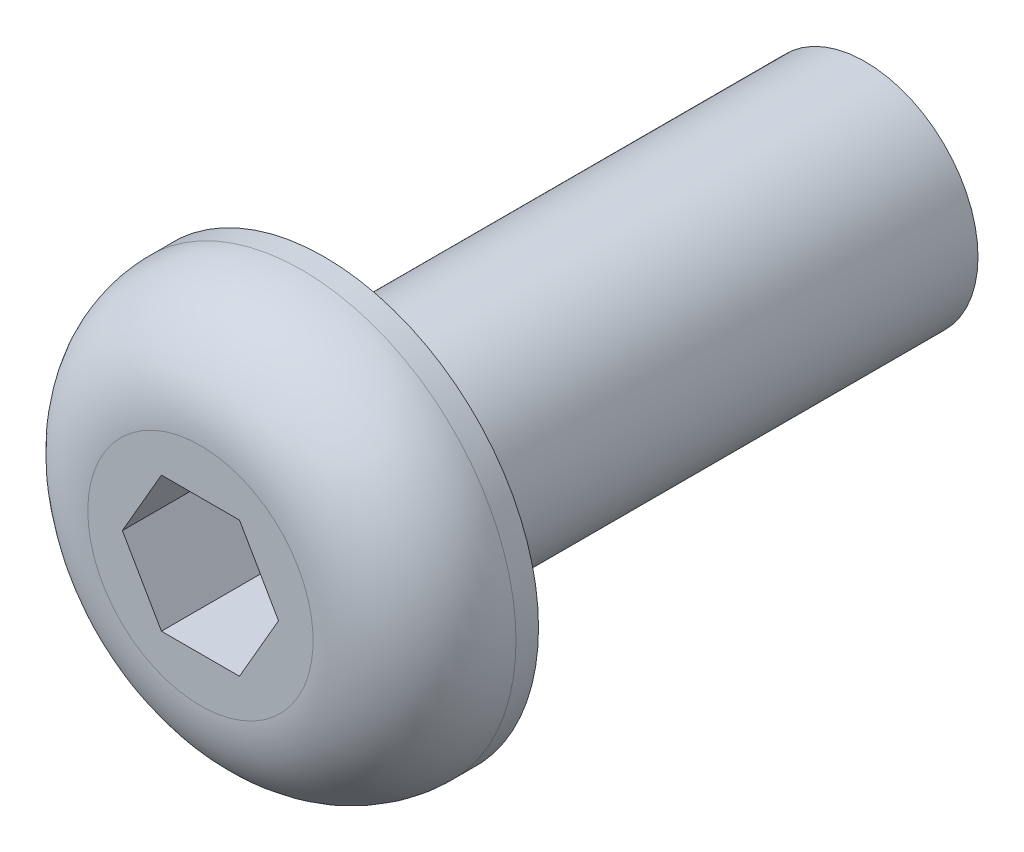
ISO-10303-21;
HEADER;
FILE_DESCRIPTION(('STEP AP214'),'2;1');
FILE_NAME('part.step','',(''),(''),'','','');
FILE_SCHEMA(('AUTOMOTIVE_DESIGN { 1 0 10303 214 1 1 1 1 }'));
ENDSEC;
DATA;
#1=APPLICATION_CONTEXT('core data for automotive mechanical design processes');
#2=APPLICATION_PROTOCOL_DEFINITION('international standard','automotive_design',2000,#1);
#3=PRODUCT_CONTEXT('',#1,'mechanical');
#4=PRODUCT('Part','Part','',(#3));
#5=PRODUCT_RELATED_PRODUCT_CATEGORY('part','',(#4));
#6=PRODUCT_DEFINITION_FORMATION('','',#4);
#7=PRODUCT_DEFINITION_CONTEXT('part definition',#1,'design');
#8=PRODUCT_DEFINITION('design','',#6,#7);
#9=PRODUCT_DEFINITION_SHAPE('','',#8);
#10=(LENGTH_UNIT() NAMED_UNIT(*) SI_UNIT(.MILLI.,.METRE.));
#11=(NAMED_UNIT(*) PLANE_ANGLE_UNIT() SI_UNIT($,.RADIAN.));
#12=(NAMED_UNIT(*) SI_UNIT($,.STERADIAN.) SOLID_ANGLE_UNIT());
#13=UNCERTAINTY_MEASURE_WITH_UNIT(LENGTH_MEASURE(1.E-05),#10,'distance_accuracy_value','');
#14=(GEOMETRIC_REPRESENTATION_CONTEXT(3) GLOBAL_UNCERTAINTY_ASSIGNED_CONTEXT((#13)) GLOBAL_UNIT_ASSIGNED_CONTEXT((#10,
#11,#12)) REPRESENTATION_CONTEXT('',''));
#15=CARTESIAN_POINT('',(0.,0.,0.));
#16=DIRECTION('',(0.,0.,1.));
#17=DIRECTION('',(1.,0.,0.));
#18=AXIS2_PLACEMENT_3D('',#15,#16,#17);
#19=CARTESIAN_POINT('',(0.,0.,-12.));
#20=DIRECTION('',(0.,0.,1.));
#21=DIRECTION('',(1.,0.,0.));
#22=AXIS2_PLACEMENT_3D('',#19,#20,#21);
#23=CYLINDRICAL_SURFACE('',#22,2.5);
#24=CARTESIAN_POINT('',(0.,0.,-12.));
#25=DIRECTION('',(0.,0.,1.));
#26=DIRECTION('',(1.,0.,0.));
#27=AXIS2_PLACEMENT_3D('',#24,#25,#26);
#28=CIRCLE('',#27,2.5);
#29=CARTESIAN_POINT('',(2.5,0.,-12.));
#30=VERTEX_POINT('',#29);
#31=EDGE_CURVE('E11',#30,#30,#28,.T.);
#32=ORIENTED_EDGE('',*,*,#31,.T.);
#33=EDGE_LOOP('',(#32));
#34=FACE_BOUND('',#33,.T.);
#35=CARTESIAN_POINT('',(0.,0.,0.));
#36=DIRECTION('',(0.,0.,1.));
#37=DIRECTION('',(1.,0.,0.));
#38=AXIS2_PLACEMENT_3D('',#35,#36,#37);
#39=CIRCLE('',#38,2.5);
#40=CARTESIAN_POINT('',(2.5,0.,0.));
#41=VERTEX_POINT('',#40);
#42=EDGE_CURVE('E37',#41,#41,#39,.T.);
#43=ORIENTED_EDGE('',*,*,#42,.F.);
#44=EDGE_LOOP('',(#43));
#45=FACE_BOUND('',#44,.T.);
#46=ADVANCED_FACE('F34',(#34,#45),#23,.T.);
#47=CARTESIAN_POINT('',(0.,0.,-12.));
#48=DIRECTION('',(0.,0.,1.));
#49=DIRECTION('',(1.,0.,0.));
#50=AXIS2_PLACEMENT_3D('',#47,#48,#49);
#51=PLANE('',#50);
#52=ORIENTED_EDGE('',*,*,#31,.F.);
#53=EDGE_LOOP('',(#52));
#54=FACE_BOUND('',#53,.T.);
#55=ADVANCED_FACE('F157',(#54),#51,.F.);
#56=CARTESIAN_POINT('',(0.,0.,2.75));
#57=DIRECTION('',(0.,0.,1.));
#58=DIRECTION('',(1.,0.,0.));
#59=AXIS2_PLACEMENT_3D('',#56,#57,#58);
#60=PLANE('',#59);
#61=DIRECTION('',(-1.,0.,0.));
#62=VECTOR('',#61,1.);
#63=CARTESIAN_POINT('',(0.866025403784439,1.5,2.75));
#64=LINE('',#63,#62);
#65=CARTESIAN_POINT('',(0.866025403784439,1.5,2.75));
#66=VERTEX_POINT('',#65);
#67=CARTESIAN_POINT('',(-0.866025403784438,1.5,2.75));
#68=VERTEX_POINT('',#67);
#69=EDGE_CURVE('E48',#66,#68,#64,.T.);
#70=ORIENTED_EDGE('',*,*,#69,.F.);
#71=DIRECTION('',(-0.5,0.866025403784439,0.));
#72=VECTOR('',#71,1.);
#73=CARTESIAN_POINT('',(1.73205080756888,0.,2.75));
#74=LINE('',#73,#72);
#75=CARTESIAN_POINT('',(1.73205080756888,0.,2.75));
#76=VERTEX_POINT('',#75);
#77=EDGE_CURVE('E131',#76,#66,#74,.T.);
#78=ORIENTED_EDGE('',*,*,#77,.F.);
#79=DIRECTION('',(0.5,0.866025403784439,0.));
#80=VECTOR('',#79,1.);
#81=CARTESIAN_POINT('',(0.866025403784439,-1.5,2.75));
#82=LINE('',#81,#80);
#83=CARTESIAN_POINT('',(0.866025403784439,-1.5,2.75));
#84=VERTEX_POINT('',#83);
#85=EDGE_CURVE('E129',#84,#76,#82,.T.);
#86=ORIENTED_EDGE('',*,*,#85,.F.);
#87=DIRECTION('',(1.,0.,0.));
#88=VECTOR('',#87,1.);
#89=CARTESIAN_POINT('',(-0.866025403784439,-1.5,2.75));
#90=LINE('',#89,#88);
#91=CARTESIAN_POINT('',(-0.866025403784439,-1.5,2.75));
#92=VERTEX_POINT('',#91);
#93=EDGE_CURVE('E96',#92,#84,#90,.T.);
#94=ORIENTED_EDGE('',*,*,#93,.F.);
#95=DIRECTION('',(0.5,-0.866025403784439,0.));
#96=VECTOR('',#95,1.);
#97=CARTESIAN_POINT('',(-1.73205080756888,0.,2.75));
#98=LINE('',#97,#96);
#99=CARTESIAN_POINT('',(-1.73205080756888,0.,2.75));
#100=VERTEX_POINT('',#99);
#101=EDGE_CURVE('E125',#100,#92,#98,.T.);
#102=ORIENTED_EDGE('',*,*,#101,.F.);
#103=DIRECTION('',(-0.5,-0.866025403784439,0.));
#104=VECTOR('',#103,1.);
#105=CARTESIAN_POINT('',(-0.866025403784438,1.5,2.75));
#106=LINE('',#105,#104);
#107=EDGE_CURVE('E122',#68,#100,#106,.T.);
#108=ORIENTED_EDGE('',*,*,#107,.F.);
#109=EDGE_LOOP('',(#70,#78,#86,#94,#102,#108));
#110=FACE_BOUND('',#109,.T.);
#111=CARTESIAN_POINT('',(0.,0.,2.75));
#112=DIRECTION('',(0.,0.,-1.));
#113=DIRECTION('',(-1.,0.,0.));
#114=AXIS2_PLACEMENT_3D('',#111,#112,#113);
#115=CIRCLE('',#114,2.5);
#116=CARTESIAN_POINT('',(-2.5,0.,2.75));
#117=VERTEX_POINT('',#116);
#118=EDGE_CURVE('E146',#117,#117,#115,.T.);
#119=ORIENTED_EDGE('',*,*,#118,.F.);
#120=EDGE_LOOP('',(#119));
#121=FACE_BOUND('',#120,.T.);
#122=ADVANCED_FACE('F162',(#110,#121),#60,.T.);
#123=CARTESIAN_POINT('',(0.,0.,0.5));
#124=DIRECTION('',(0.,0.,-1.));
#125=DIRECTION('',(-1.,0.,0.));
#126=AXIS2_PLACEMENT_3D('',#123,#124,#125);
#127=TOROIDAL_SURFACE('',#126,2.5,2.25);
#128=ORIENTED_EDGE('',*,*,#118,.T.);
#129=EDGE_LOOP('',(#128));
#130=FACE_BOUND('',#129,.T.);
#131=CARTESIAN_POINT('',(0.,0.,0.5));
#132=DIRECTION('',(0.,0.,-1.));
#133=DIRECTION('',(-1.,0.,0.));
#134=AXIS2_PLACEMENT_3D('',#131,#132,#133);
#135=CIRCLE('',#134,4.75);
#136=CARTESIAN_POINT('',(-4.75,0.,0.5));
#137=VERTEX_POINT('',#136);
#138=EDGE_CURVE('E143',#137,#137,#135,.T.);
#139=ORIENTED_EDGE('',*,*,#138,.F.);
#140=EDGE_LOOP('',(#139));
#141=FACE_BOUND('',#140,.T.);
#142=ADVANCED_FACE('F168',(#130,#141),#127,.T.);
#143=CARTESIAN_POINT('',(0.,0.,0.));
#144=DIRECTION('',(0.,0.,-1.));
#145=DIRECTION('',(-1.,0.,0.));
#146=AXIS2_PLACEMENT_3D('',#143,#144,#145);
#147=CYLINDRICAL_SURFACE('',#146,4.75);
#148=ORIENTED_EDGE('',*,*,#138,.T.);
#149=EDGE_LOOP('',(#148));
#150=FACE_BOUND('',#149,.T.);
#151=CARTESIAN_POINT('',(0.,0.,0.));
#152=DIRECTION('',(0.,0.,-1.));
#153=DIRECTION('',(-1.,0.,0.));
#154=AXIS2_PLACEMENT_3D('',#151,#152,#153);
#155=CIRCLE('',#154,4.75);
#156=CARTESIAN_POINT('',(-4.75,0.,0.));
#157=VERTEX_POINT('',#156);
#158=EDGE_CURVE('E135',#157,#157,#155,.T.);
#159=ORIENTED_EDGE('',*,*,#158,.F.);
#160=EDGE_LOOP('',(#159));
#161=FACE_BOUND('',#160,.T.);
#162=ADVANCED_FACE('F174',(#150,#161),#147,.T.);
#163=CARTESIAN_POINT('',(0.,0.,0.));
#164=DIRECTION('',(0.,0.,-1.));
#165=DIRECTION('',(-1.,0.,0.));
#166=AXIS2_PLACEMENT_3D('',#163,#164,#165);
#167=PLANE('',#166);
#168=ORIENTED_EDGE('',*,*,#42,.T.);
#169=EDGE_LOOP('',(#168));
#170=FACE_BOUND('',#169,.T.);
#171=ORIENTED_EDGE('',*,*,#158,.T.);
#172=EDGE_LOOP('',(#171));
#173=FACE_BOUND('',#172,.T.);
#174=ADVANCED_FACE('F153',(#170,#173),#167,.T.);
#175=CARTESIAN_POINT('',(0.866025403784439,1.5,0.25));
#176=DIRECTION('',(0.,1.,0.));
#177=DIRECTION('',(-1.,0.,0.));
#178=AXIS2_PLACEMENT_3D('',#175,#176,#177);
#179=PLANE('',#178);
#180=ORIENTED_EDGE('',*,*,#69,.T.);
#181=DIRECTION('',(0.,0.,1.));
#182=VECTOR('',#181,1.);
#183=CARTESIAN_POINT('',(-0.866025403784438,1.5,0.25));
#184=LINE('',#183,#182);
#185=CARTESIAN_POINT('',(-0.866025403784438,1.5,0.25));
#186=VERTEX_POINT('',#185);
#187=EDGE_CURVE('E78',#186,#68,#184,.T.);
#188=ORIENTED_EDGE('',*,*,#187,.F.);
#189=DIRECTION('',(-1.,0.,0.));
#190=VECTOR('',#189,1.);
#191=CARTESIAN_POINT('',(0.866025403784439,1.5,0.25));
#192=LINE('',#191,#190);
#193=CARTESIAN_POINT('',(0.866025403784439,1.5,0.25));
#194=VERTEX_POINT('',#193);
#195=EDGE_CURVE('E133',#194,#186,#192,.T.);
#196=ORIENTED_EDGE('',*,*,#195,.F.);
#197=DIRECTION('',(0.,0.,1.));
#198=VECTOR('',#197,1.);
#199=CARTESIAN_POINT('',(0.866025403784439,1.5,0.25));
#200=LINE('',#199,#198);
#201=EDGE_CURVE('E56',#194,#66,#200,.T.);
#202=ORIENTED_EDGE('',*,*,#201,.T.);
#203=EDGE_LOOP('',(#180,#188,#196,#202));
#204=FACE_BOUND('',#203,.T.);
#205=ADVANCED_FACE('F180',(#204),#179,.F.);
#206=CARTESIAN_POINT('',(1.73205080756888,0.,0.25));
#207=DIRECTION('',(0.866025403784439,0.5,0.));
#208=DIRECTION('',(-0.5,0.866025403784439,0.));
#209=AXIS2_PLACEMENT_3D('',#206,#207,#208);
#210=PLANE('',#209);
#211=ORIENTED_EDGE('',*,*,#77,.T.);
#212=ORIENTED_EDGE('',*,*,#201,.F.);
#213=DIRECTION('',(-0.5,0.866025403784439,0.));
#214=VECTOR('',#213,1.);
#215=CARTESIAN_POINT('',(1.73205080756888,0.,0.25));
#216=LINE('',#215,#214);
#217=CARTESIAN_POINT('',(1.73205080756888,0.,0.25));
#218=VERTEX_POINT('',#217);
#219=EDGE_CURVE('E108',#218,#194,#216,.T.);
#220=ORIENTED_EDGE('',*,*,#219,.F.);
#221=DIRECTION('',(0.,0.,1.));
#222=VECTOR('',#221,1.);
#223=CARTESIAN_POINT('',(1.73205080756888,0.,0.25));
#224=LINE('',#223,#222);
#225=EDGE_CURVE('E100',#218,#76,#224,.T.);
#226=ORIENTED_EDGE('',*,*,#225,.T.);
#227=EDGE_LOOP('',(#211,#212,#220,#226));
#228=FACE_BOUND('',#227,.T.);
#229=ADVANCED_FACE('F183',(#228),#210,.F.);
#230=CARTESIAN_POINT('',(0.866025403784439,-1.5,0.25));
#231=DIRECTION('',(0.866025403784439,-0.5,0.));
#232=DIRECTION('',(0.5,0.866025403784439,0.));
#233=AXIS2_PLACEMENT_3D('',#230,#231,#232);
#234=PLANE('',#233);
#235=ORIENTED_EDGE('',*,*,#85,.T.);
#236=ORIENTED_EDGE('',*,*,#225,.F.);
#237=DIRECTION('',(0.5,0.866025403784439,0.));
#238=VECTOR('',#237,1.);
#239=CARTESIAN_POINT('',(0.866025403784439,-1.5,0.25));
#240=LINE('',#239,#238);
#241=CARTESIAN_POINT('',(0.866025403784439,-1.5,0.25));
#242=VERTEX_POINT('',#241);
#243=EDGE_CURVE('E104',#242,#218,#240,.T.);
#244=ORIENTED_EDGE('',*,*,#243,.F.);
#245=DIRECTION('',(0.,0.,1.));
#246=VECTOR('',#245,1.);
#247=CARTESIAN_POINT('',(0.866025403784439,-1.5,0.25));
#248=LINE('',#247,#246);
#249=EDGE_CURVE('E89',#242,#84,#248,.T.);
#250=ORIENTED_EDGE('',*,*,#249,.T.);
#251=EDGE_LOOP('',(#235,#236,#244,#250));
#252=FACE_BOUND('',#251,.T.);
#253=ADVANCED_FACE('F105',(#252),#234,.F.);
#254=CARTESIAN_POINT('',(-0.866025403784439,-1.5,0.25));
#255=DIRECTION('',(0.,-1.,0.));
#256=DIRECTION('',(0.,0.,-1.));
#257=AXIS2_PLACEMENT_3D('',#254,#255,#256);
#258=PLANE('',#257);
#259=ORIENTED_EDGE('',*,*,#93,.T.);
#260=ORIENTED_EDGE('',*,*,#249,.F.);
#261=DIRECTION('',(1.,0.,0.));
#262=VECTOR('',#261,1.);
#263=CARTESIAN_POINT('',(-0.866025403784439,-1.5,0.25));
#264=LINE('',#263,#262);
#265=CARTESIAN_POINT('',(-0.866025403784439,-1.5,0.25));
#266=VERTEX_POINT('',#265);
#267=EDGE_CURVE('E93',#266,#242,#264,.T.);
#268=ORIENTED_EDGE('',*,*,#267,.F.);
#269=DIRECTION('',(0.,0.,1.));
#270=VECTOR('',#269,1.);
#271=CARTESIAN_POINT('',(-0.866025403784439,-1.5,0.25));
#272=LINE('',#271,#270);
#273=EDGE_CURVE('E101',#266,#92,#272,.T.);
#274=ORIENTED_EDGE('',*,*,#273,.T.);
#275=EDGE_LOOP('',(#259,#260,#268,#274));
#276=FACE_BOUND('',#275,.T.);
#277=ADVANCED_FACE('F91',(#276),#258,.F.);
#278=CARTESIAN_POINT('',(-1.73205080756888,0.,0.25));
#279=DIRECTION('',(-0.866025403784439,-0.5,0.));
#280=DIRECTION('',(0.5,-0.866025403784439,0.));
#281=AXIS2_PLACEMENT_3D('',#278,#279,#280);
#282=PLANE('',#281);
#283=ORIENTED_EDGE('',*,*,#101,.T.);
#284=ORIENTED_EDGE('',*,*,#273,.F.);
#285=DIRECTION('',(0.5,-0.866025403784439,0.));
#286=VECTOR('',#285,1.);
#287=CARTESIAN_POINT('',(-1.73205080756888,0.,0.25));
#288=LINE('',#287,#286);
#289=CARTESIAN_POINT('',(-1.73205080756888,0.,0.25));
#290=VERTEX_POINT('',#289);
#291=EDGE_CURVE('E114',#290,#266,#288,.T.);
#292=ORIENTED_EDGE('',*,*,#291,.F.);
#293=DIRECTION('',(0.,0.,1.));
#294=VECTOR('',#293,1.);
#295=CARTESIAN_POINT('',(-1.73205080756888,0.,0.25));
#296=LINE('',#295,#294);
#297=EDGE_CURVE('E138',#290,#100,#296,.T.);
#298=ORIENTED_EDGE('',*,*,#297,.T.);
#299=EDGE_LOOP('',(#283,#284,#292,#298));
#300=FACE_BOUND('',#299,.T.);
#301=ADVANCED_FACE('F187',(#300),#282,.F.);
#302=CARTESIAN_POINT('',(-0.866025403784438,1.5,0.25));
#303=DIRECTION('',(-0.866025403784439,0.5,0.));
#304=DIRECTION('',(-0.5,-0.866025403784439,0.));
#305=AXIS2_PLACEMENT_3D('',#302,#303,#304);
#306=PLANE('',#305);
#307=ORIENTED_EDGE('',*,*,#107,.T.);
#308=ORIENTED_EDGE('',*,*,#297,.F.);
#309=DIRECTION('',(-0.5,-0.866025403784439,0.));
#310=VECTOR('',#309,1.);
#311=CARTESIAN_POINT('',(-0.866025403784438,1.5,0.25));
#312=LINE('',#311,#310);
#313=EDGE_CURVE('E116',#186,#290,#312,.T.);
#314=ORIENTED_EDGE('',*,*,#313,.F.);
#315=ORIENTED_EDGE('',*,*,#187,.T.);
#316=EDGE_LOOP('',(#307,#308,#314,#315));
#317=FACE_BOUND('',#316,.T.);
#318=ADVANCED_FACE('F184',(#317),#306,.F.);
#319=CARTESIAN_POINT('',(-2.59807621135331,1.5,0.25));
#320=DIRECTION('',(0.,0.,1.));
#321=DIRECTION('',(1.,0.,0.));
#322=AXIS2_PLACEMENT_3D('',#319,#320,#321);
#323=PLANE('',#322);
#324=ORIENTED_EDGE('',*,*,#195,.T.);
#325=ORIENTED_EDGE('',*,*,#313,.T.);
#326=ORIENTED_EDGE('',*,*,#291,.T.);
#327=ORIENTED_EDGE('',*,*,#267,.T.);
#328=ORIENTED_EDGE('',*,*,#243,.T.);
#329=ORIENTED_EDGE('',*,*,#219,.T.);
#330=EDGE_LOOP('',(#324,#325,#326,#327,#328,#329));
#331=FACE_BOUND('',#330,.T.);
#332=ADVANCED_FACE('F111',(#331),#323,.T.);
#333=CLOSED_SHELL('',(#46,#55,#122,#142,#162,#174,#205,#229,#253,#277,#301,#318,#332));
#334=MANIFOLD_SOLID_BREP('B2',#333);
#335=ADVANCED_BREP_SHAPE_REPRESENTATION('',(#18,#334),#14);
#336=SHAPE_DEFINITION_REPRESENTATION(#9,#335);
ENDSEC;
END-ISO-10303-21;
